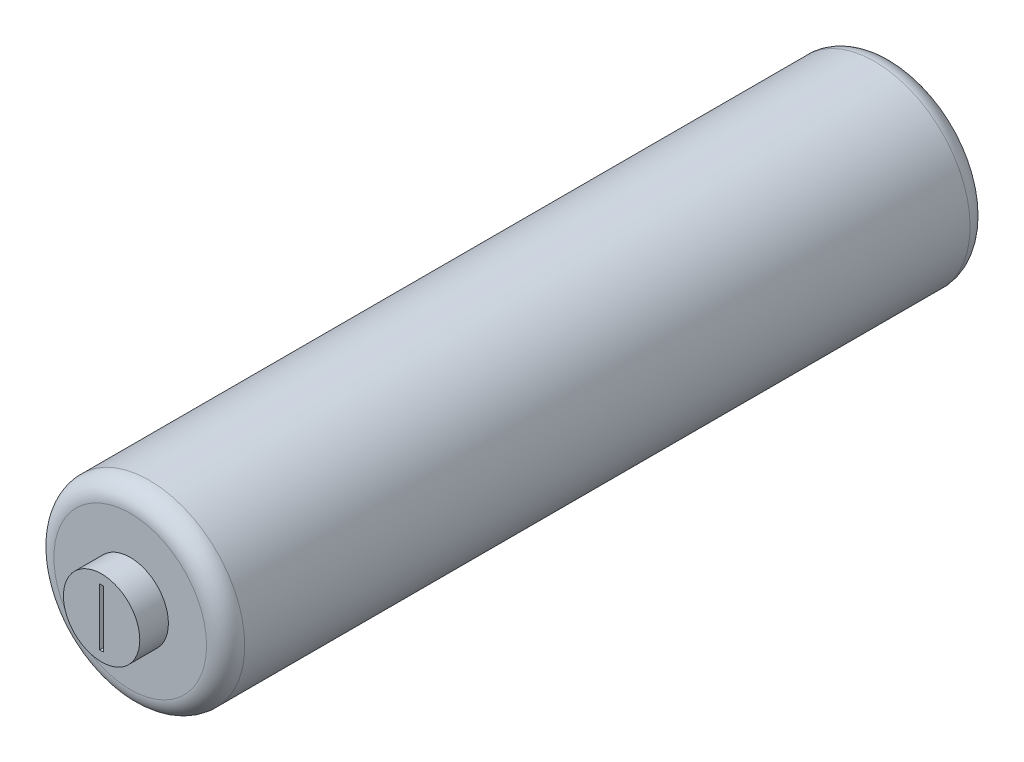
ISO-10303-21;
HEADER;
FILE_DESCRIPTION(('STEP AP214'),'2;1');
FILE_NAME('part.step','',(''),(''),'','','');
FILE_SCHEMA(('AUTOMOTIVE_DESIGN { 1 0 10303 214 1 1 1 1 }'));
ENDSEC;
DATA;
#1=APPLICATION_CONTEXT('core data for automotive mechanical design processes');
#2=APPLICATION_PROTOCOL_DEFINITION('international standard','automotive_design',2000,#1);
#3=PRODUCT_CONTEXT('',#1,'mechanical');
#4=PRODUCT('Part','Part','',(#3));
#5=PRODUCT_RELATED_PRODUCT_CATEGORY('part','',(#4));
#6=PRODUCT_DEFINITION_FORMATION('','',#4);
#7=PRODUCT_DEFINITION_CONTEXT('part definition',#1,'design');
#8=PRODUCT_DEFINITION('design','',#6,#7);
#9=PRODUCT_DEFINITION_SHAPE('','',#8);
#10=(LENGTH_UNIT() NAMED_UNIT(*) SI_UNIT(.MILLI.,.METRE.));
#11=(NAMED_UNIT(*) PLANE_ANGLE_UNIT() SI_UNIT($,.RADIAN.));
#12=(NAMED_UNIT(*) SI_UNIT($,.STERADIAN.) SOLID_ANGLE_UNIT());
#13=UNCERTAINTY_MEASURE_WITH_UNIT(LENGTH_MEASURE(1.E-05),#10,'distance_accuracy_value','');
#14=(GEOMETRIC_REPRESENTATION_CONTEXT(3) GLOBAL_UNCERTAINTY_ASSIGNED_CONTEXT((#13)) GLOBAL_UNIT_ASSIGNED_CONTEXT((#10,
#11,#12)) REPRESENTATION_CONTEXT('',''));
#15=CARTESIAN_POINT('',(0.,0.,0.));
#16=DIRECTION('',(0.,0.,1.));
#17=DIRECTION('',(1.,0.,0.));
#18=AXIS2_PLACEMENT_3D('',#15,#16,#17);
#19=CARTESIAN_POINT('',(0.,0.,-1075.));
#20=DIRECTION('',(0.,0.,-1.));
#21=DIRECTION('',(1.,0.,0.));
#22=AXIS2_PLACEMENT_3D('',#19,#20,#21);
#23=PLANE('',#22);
#24=CARTESIAN_POINT('',(0.,0.,-1075.));
#25=DIRECTION('',(0.,0.,1.));
#26=DIRECTION('',(1.,0.,0.));
#27=AXIS2_PLACEMENT_3D('',#24,#25,#26);
#28=CIRCLE('',#27,100.);
#29=CARTESIAN_POINT('',(100.,0.,-1075.));
#30=VERTEX_POINT('',#29);
#31=EDGE_CURVE('E154',#30,#30,#28,.T.);
#32=ORIENTED_EDGE('',*,*,#31,.F.);
#33=EDGE_LOOP('',(#32));
#34=FACE_BOUND('',#33,.T.);
#35=DIRECTION('',(1.,0.,0.));
#36=VECTOR('',#35,1.);
#37=CARTESIAN_POINT('',(-4.99999999999999,-75.,-1075.));
#38=LINE('',#37,#36);
#39=CARTESIAN_POINT('',(-4.99999999999999,-75.,-1075.));
#40=VERTEX_POINT('',#39);
#41=CARTESIAN_POINT('',(5.00000000000001,-75.,-1075.));
#42=VERTEX_POINT('',#41);
#43=EDGE_CURVE('E145',#40,#42,#38,.T.);
#44=ORIENTED_EDGE('',*,*,#43,.T.);
#45=DIRECTION('',(0.,1.,0.));
#46=VECTOR('',#45,1.);
#47=CARTESIAN_POINT('',(4.99999999999999,75.,-1075.));
#48=LINE('',#47,#46);
#49=CARTESIAN_POINT('',(4.99999999999999,75.,-1075.));
#50=VERTEX_POINT('',#49);
#51=EDGE_CURVE('E59',#42,#50,#48,.T.);
#52=ORIENTED_EDGE('',*,*,#51,.T.);
#53=DIRECTION('',(-1.,0.,0.));
#54=VECTOR('',#53,1.);
#55=CARTESIAN_POINT('',(-5.00000000000001,75.,-1075.));
#56=LINE('',#55,#54);
#57=CARTESIAN_POINT('',(-5.00000000000001,75.,-1075.));
#58=VERTEX_POINT('',#57);
#59=EDGE_CURVE('E132',#50,#58,#56,.T.);
#60=ORIENTED_EDGE('',*,*,#59,.T.);
#61=DIRECTION('',(0.,-1.,0.));
#62=VECTOR('',#61,1.);
#63=CARTESIAN_POINT('',(-5.00000000000001,75.,-1075.));
#64=LINE('',#63,#62);
#65=EDGE_CURVE('E136',#58,#40,#64,.T.);
#66=ORIENTED_EDGE('',*,*,#65,.T.);
#67=EDGE_LOOP('',(#44,#52,#60,#66));
#68=FACE_BOUND('',#67,.T.);
#69=ADVANCED_FACE('F43',(#34,#68),#23,.T.);
#70=CARTESIAN_POINT('',(0.,0.,1000.));
#71=DIRECTION('',(0.,0.,-1.));
#72=DIRECTION('',(-1.,0.,0.));
#73=AXIS2_PLACEMENT_3D('',#70,#71,#72);
#74=CYLINDRICAL_SURFACE('',#73,250.);
#75=CARTESIAN_POINT('',(0.,0.,-950.));
#76=DIRECTION('',(0.,0.,1.));
#77=DIRECTION('',(1.,0.,0.));
#78=AXIS2_PLACEMENT_3D('',#75,#76,#77);
#79=CIRCLE('',#78,250.);
#80=CARTESIAN_POINT('',(250.,0.,-950.));
#81=VERTEX_POINT('',#80);
#82=EDGE_CURVE('E221',#81,#81,#79,.T.);
#83=ORIENTED_EDGE('',*,*,#82,.T.);
#84=EDGE_LOOP('',(#83));
#85=FACE_BOUND('',#84,.T.);
#86=CARTESIAN_POINT('',(0.,0.,950.));
#87=DIRECTION('',(0.,0.,1.));
#88=DIRECTION('',(1.,0.,0.));
#89=AXIS2_PLACEMENT_3D('',#86,#87,#88);
#90=CIRCLE('',#89,250.);
#91=CARTESIAN_POINT('',(250.,0.,950.));
#92=VERTEX_POINT('',#91);
#93=EDGE_CURVE('E214',#92,#92,#90,.F.);
#94=ORIENTED_EDGE('',*,*,#93,.T.);
#95=EDGE_LOOP('',(#94));
#96=FACE_BOUND('',#95,.T.);
#97=ADVANCED_FACE('F236',(#85,#96),#74,.T.);
#98=CARTESIAN_POINT('',(0.,0.,1000.));
#99=DIRECTION('',(0.,0.,1.));
#100=DIRECTION('',(1.,0.,0.));
#101=AXIS2_PLACEMENT_3D('',#98,#99,#100);
#102=PLANE('',#101);
#103=CARTESIAN_POINT('',(0.,0.,1000.));
#104=DIRECTION('',(0.,0.,1.));
#105=DIRECTION('',(1.,0.,0.));
#106=AXIS2_PLACEMENT_3D('',#103,#104,#105);
#107=CIRCLE('',#106,200.);
#108=CARTESIAN_POINT('',(200.,0.,1000.));
#109=VERTEX_POINT('',#108);
#110=EDGE_CURVE('E11',#109,#109,#107,.T.);
#111=ORIENTED_EDGE('',*,*,#110,.T.);
#112=EDGE_LOOP('',(#111));
#113=FACE_BOUND('',#112,.T.);
#114=CARTESIAN_POINT('',(0.,0.,1000.));
#115=DIRECTION('',(0.,0.,1.));
#116=DIRECTION('',(1.,0.,0.));
#117=AXIS2_PLACEMENT_3D('',#114,#115,#116);
#118=CIRCLE('',#117,100.);
#119=CARTESIAN_POINT('',(100.,0.,1000.));
#120=VERTEX_POINT('',#119);
#121=EDGE_CURVE('E210',#120,#120,#118,.F.);
#122=ORIENTED_EDGE('',*,*,#121,.T.);
#123=EDGE_LOOP('',(#122));
#124=FACE_BOUND('',#123,.T.);
#125=ADVANCED_FACE('F239',(#113,#124),#102,.T.);
#126=CARTESIAN_POINT('',(0.,0.,-1000.));
#127=DIRECTION('',(0.,0.,1.));
#128=DIRECTION('',(1.,0.,0.));
#129=AXIS2_PLACEMENT_3D('',#126,#127,#128);
#130=PLANE('',#129);
#131=CARTESIAN_POINT('',(0.,0.,-1000.));
#132=DIRECTION('',(0.,0.,1.));
#133=DIRECTION('',(1.,0.,0.));
#134=AXIS2_PLACEMENT_3D('',#131,#132,#133);
#135=CIRCLE('',#134,200.);
#136=CARTESIAN_POINT('',(200.,0.,-1000.));
#137=VERTEX_POINT('',#136);
#138=EDGE_CURVE('E52',#137,#137,#135,.F.);
#139=ORIENTED_EDGE('',*,*,#138,.T.);
#140=EDGE_LOOP('',(#139));
#141=FACE_BOUND('',#140,.T.);
#142=CARTESIAN_POINT('',(0.,0.,-1000.));
#143=DIRECTION('',(0.,0.,1.));
#144=DIRECTION('',(1.,0.,0.));
#145=AXIS2_PLACEMENT_3D('',#142,#143,#144);
#146=CIRCLE('',#145,100.);
#147=CARTESIAN_POINT('',(100.,0.,-1000.));
#148=VERTEX_POINT('',#147);
#149=EDGE_CURVE('E163',#148,#148,#146,.T.);
#150=ORIENTED_EDGE('',*,*,#149,.T.);
#151=EDGE_LOOP('',(#150));
#152=FACE_BOUND('',#151,.T.);
#153=ADVANCED_FACE('F228',(#141,#152),#130,.F.);
#154=CARTESIAN_POINT('',(0.,0.,1075.));
#155=DIRECTION('',(0.,0.,-1.));
#156=DIRECTION('',(-1.,0.,0.));
#157=AXIS2_PLACEMENT_3D('',#154,#155,#156);
#158=CYLINDRICAL_SURFACE('',#157,100.);
#159=ORIENTED_EDGE('',*,*,#121,.F.);
#160=EDGE_LOOP('',(#159));
#161=FACE_BOUND('',#160,.T.);
#162=CARTESIAN_POINT('',(0.,0.,1075.));
#163=DIRECTION('',(0.,0.,1.));
#164=DIRECTION('',(1.,0.,0.));
#165=AXIS2_PLACEMENT_3D('',#162,#163,#164);
#166=CIRCLE('',#165,100.);
#167=CARTESIAN_POINT('',(100.,0.,1075.));
#168=VERTEX_POINT('',#167);
#169=EDGE_CURVE('E198',#168,#168,#166,.T.);
#170=ORIENTED_EDGE('',*,*,#169,.F.);
#171=EDGE_LOOP('',(#170));
#172=FACE_BOUND('',#171,.T.);
#173=ADVANCED_FACE('F252',(#161,#172),#158,.T.);
#174=CARTESIAN_POINT('',(0.,0.,1075.));
#175=DIRECTION('',(0.,0.,1.));
#176=DIRECTION('',(1.,0.,0.));
#177=AXIS2_PLACEMENT_3D('',#174,#175,#176);
#178=PLANE('',#177);
#179=DIRECTION('',(0.,1.,0.));
#180=VECTOR('',#179,1.);
#181=CARTESIAN_POINT('',(4.99999999999999,75.,1075.));
#182=LINE('',#181,#180);
#183=CARTESIAN_POINT('',(5.00000000000001,-75.,1075.));
#184=VERTEX_POINT('',#183);
#185=CARTESIAN_POINT('',(4.99999999999999,75.,1075.));
#186=VERTEX_POINT('',#185);
#187=EDGE_CURVE('E67',#184,#186,#182,.T.);
#188=ORIENTED_EDGE('',*,*,#187,.F.);
#189=DIRECTION('',(1.,0.,0.));
#190=VECTOR('',#189,1.);
#191=CARTESIAN_POINT('',(-4.99999999999999,-75.,1075.));
#192=LINE('',#191,#190);
#193=CARTESIAN_POINT('',(-4.99999999999999,-75.,1075.));
#194=VERTEX_POINT('',#193);
#195=EDGE_CURVE('E169',#194,#184,#192,.T.);
#196=ORIENTED_EDGE('',*,*,#195,.F.);
#197=DIRECTION('',(0.,-1.,0.));
#198=VECTOR('',#197,1.);
#199=CARTESIAN_POINT('',(-5.00000000000001,75.,1075.));
#200=LINE('',#199,#198);
#201=CARTESIAN_POINT('',(-5.00000000000001,75.,1075.));
#202=VERTEX_POINT('',#201);
#203=EDGE_CURVE('E188',#202,#194,#200,.T.);
#204=ORIENTED_EDGE('',*,*,#203,.F.);
#205=DIRECTION('',(-1.,0.,0.));
#206=VECTOR('',#205,1.);
#207=CARTESIAN_POINT('',(-5.00000000000001,75.,1075.));
#208=LINE('',#207,#206);
#209=EDGE_CURVE('E184',#186,#202,#208,.T.);
#210=ORIENTED_EDGE('',*,*,#209,.F.);
#211=EDGE_LOOP('',(#188,#196,#204,#210));
#212=FACE_BOUND('',#211,.T.);
#213=ORIENTED_EDGE('',*,*,#169,.T.);
#214=EDGE_LOOP('',(#213));
#215=FACE_BOUND('',#214,.T.);
#216=ADVANCED_FACE('F255',(#212,#215),#178,.T.);
#217=CARTESIAN_POINT('',(4.99999999999999,75.,1065.));
#218=DIRECTION('',(1.,0.,0.));
#219=DIRECTION('',(0.,1.,0.));
#220=AXIS2_PLACEMENT_3D('',#217,#218,#219);
#221=PLANE('',#220);
#222=ORIENTED_EDGE('',*,*,#187,.T.);
#223=DIRECTION('',(0.,0.,1.));
#224=VECTOR('',#223,1.);
#225=CARTESIAN_POINT('',(4.99999999999999,75.,1065.));
#226=LINE('',#225,#224);
#227=CARTESIAN_POINT('',(4.99999999999999,75.,1065.));
#228=VERTEX_POINT('',#227);
#229=EDGE_CURVE('E181',#228,#186,#226,.T.);
#230=ORIENTED_EDGE('',*,*,#229,.F.);
#231=DIRECTION('',(0.,1.,0.));
#232=VECTOR('',#231,1.);
#233=CARTESIAN_POINT('',(4.99999999999999,75.,1065.));
#234=LINE('',#233,#232);
#235=CARTESIAN_POINT('',(5.00000000000001,-75.,1065.));
#236=VERTEX_POINT('',#235);
#237=EDGE_CURVE('E164',#236,#228,#234,.T.);
#238=ORIENTED_EDGE('',*,*,#237,.F.);
#239=DIRECTION('',(0.,0.,1.));
#240=VECTOR('',#239,1.);
#241=CARTESIAN_POINT('',(5.00000000000001,-75.,1065.));
#242=LINE('',#241,#240);
#243=EDGE_CURVE('E195',#236,#184,#242,.T.);
#244=ORIENTED_EDGE('',*,*,#243,.T.);
#245=EDGE_LOOP('',(#222,#230,#238,#244));
#246=FACE_BOUND('',#245,.T.);
#247=ADVANCED_FACE('F260',(#246),#221,.F.);
#248=CARTESIAN_POINT('',(-4.99999999999999,-75.,1065.));
#249=DIRECTION('',(0.,-1.,0.));
#250=DIRECTION('',(0.,0.,-1.));
#251=AXIS2_PLACEMENT_3D('',#248,#249,#250);
#252=PLANE('',#251);
#253=ORIENTED_EDGE('',*,*,#195,.T.);
#254=ORIENTED_EDGE('',*,*,#243,.F.);
#255=DIRECTION('',(1.,0.,0.));
#256=VECTOR('',#255,1.);
#257=CARTESIAN_POINT('',(-4.99999999999999,-75.,1065.));
#258=LINE('',#257,#256);
#259=CARTESIAN_POINT('',(-4.99999999999999,-75.,1065.));
#260=VERTEX_POINT('',#259);
#261=EDGE_CURVE('E177',#260,#236,#258,.T.);
#262=ORIENTED_EDGE('',*,*,#261,.F.);
#263=DIRECTION('',(0.,0.,1.));
#264=VECTOR('',#263,1.);
#265=CARTESIAN_POINT('',(-4.99999999999999,-75.,1065.));
#266=LINE('',#265,#264);
#267=EDGE_CURVE('E199',#260,#194,#266,.T.);
#268=ORIENTED_EDGE('',*,*,#267,.T.);
#269=EDGE_LOOP('',(#253,#254,#262,#268));
#270=FACE_BOUND('',#269,.T.);
#271=ADVANCED_FACE('F266',(#270),#252,.F.);
#272=CARTESIAN_POINT('',(-5.00000000000001,75.,1065.));
#273=DIRECTION('',(-1.,0.,0.));
#274=DIRECTION('',(0.,-1.,0.));
#275=AXIS2_PLACEMENT_3D('',#272,#273,#274);
#276=PLANE('',#275);
#277=ORIENTED_EDGE('',*,*,#203,.T.);
#278=ORIENTED_EDGE('',*,*,#267,.F.);
#279=DIRECTION('',(0.,-1.,0.));
#280=VECTOR('',#279,1.);
#281=CARTESIAN_POINT('',(-5.00000000000001,75.,1065.));
#282=LINE('',#281,#280);
#283=CARTESIAN_POINT('',(-5.00000000000001,75.,1065.));
#284=VERTEX_POINT('',#283);
#285=EDGE_CURVE('E173',#284,#260,#282,.T.);
#286=ORIENTED_EDGE('',*,*,#285,.F.);
#287=DIRECTION('',(0.,0.,1.));
#288=VECTOR('',#287,1.);
#289=CARTESIAN_POINT('',(-5.00000000000001,75.,1065.));
#290=LINE('',#289,#288);
#291=EDGE_CURVE('E202',#284,#202,#290,.T.);
#292=ORIENTED_EDGE('',*,*,#291,.T.);
#293=EDGE_LOOP('',(#277,#278,#286,#292));
#294=FACE_BOUND('',#293,.T.);
#295=ADVANCED_FACE('F289',(#294),#276,.F.);
#296=CARTESIAN_POINT('',(-5.00000000000001,75.,1065.));
#297=DIRECTION('',(0.,1.,0.));
#298=DIRECTION('',(0.,0.,1.));
#299=AXIS2_PLACEMENT_3D('',#296,#297,#298);
#300=PLANE('',#299);
#301=ORIENTED_EDGE('',*,*,#209,.T.);
#302=ORIENTED_EDGE('',*,*,#291,.F.);
#303=DIRECTION('',(-1.,0.,0.));
#304=VECTOR('',#303,1.);
#305=CARTESIAN_POINT('',(-5.00000000000001,75.,1065.));
#306=LINE('',#305,#304);
#307=EDGE_CURVE('E168',#228,#284,#306,.T.);
#308=ORIENTED_EDGE('',*,*,#307,.F.);
#309=ORIENTED_EDGE('',*,*,#229,.T.);
#310=EDGE_LOOP('',(#301,#302,#308,#309));
#311=FACE_BOUND('',#310,.T.);
#312=ADVANCED_FACE('F285',(#311),#300,.F.);
#313=CARTESIAN_POINT('',(0.,0.,1065.));
#314=DIRECTION('',(0.,0.,1.));
#315=DIRECTION('',(1.,0.,0.));
#316=AXIS2_PLACEMENT_3D('',#313,#314,#315);
#317=PLANE('',#316);
#318=ORIENTED_EDGE('',*,*,#237,.T.);
#319=ORIENTED_EDGE('',*,*,#307,.T.);
#320=ORIENTED_EDGE('',*,*,#285,.T.);
#321=ORIENTED_EDGE('',*,*,#261,.T.);
#322=EDGE_LOOP('',(#318,#319,#320,#321));
#323=FACE_BOUND('',#322,.T.);
#324=ADVANCED_FACE('F281',(#323),#317,.T.);
#325=CARTESIAN_POINT('',(0.,0.,-1075.));
#326=DIRECTION('',(0.,0.,1.));
#327=DIRECTION('',(1.,0.,0.));
#328=AXIS2_PLACEMENT_3D('',#325,#326,#327);
#329=CYLINDRICAL_SURFACE('',#328,100.);
#330=ORIENTED_EDGE('',*,*,#31,.T.);
#331=EDGE_LOOP('',(#330));
#332=FACE_BOUND('',#331,.T.);
#333=ORIENTED_EDGE('',*,*,#149,.F.);
#334=EDGE_LOOP('',(#333));
#335=FACE_BOUND('',#334,.T.);
#336=ADVANCED_FACE('F278',(#332,#335),#329,.T.);
#337=CARTESIAN_POINT('',(4.99999999999999,75.,-1065.));
#338=DIRECTION('',(-1.,0.,0.));
#339=DIRECTION('',(0.,-1.,0.));
#340=AXIS2_PLACEMENT_3D('',#337,#338,#339);
#341=PLANE('',#340);
#342=ORIENTED_EDGE('',*,*,#51,.F.);
#343=DIRECTION('',(0.,0.,-1.));
#344=VECTOR('',#343,1.);
#345=CARTESIAN_POINT('',(5.00000000000001,-75.,-1065.));
#346=LINE('',#345,#344);
#347=CARTESIAN_POINT('',(5.00000000000001,-75.,-1065.));
#348=VERTEX_POINT('',#347);
#349=EDGE_CURVE('E114',#348,#42,#346,.T.);
#350=ORIENTED_EDGE('',*,*,#349,.F.);
#351=DIRECTION('',(0.,1.,0.));
#352=VECTOR('',#351,1.);
#353=CARTESIAN_POINT('',(4.99999999999999,75.,-1065.));
#354=LINE('',#353,#352);
#355=CARTESIAN_POINT('',(4.99999999999999,75.,-1065.));
#356=VERTEX_POINT('',#355);
#357=EDGE_CURVE('E122',#348,#356,#354,.T.);
#358=ORIENTED_EDGE('',*,*,#357,.T.);
#359=DIRECTION('',(0.,0.,-1.));
#360=VECTOR('',#359,1.);
#361=CARTESIAN_POINT('',(4.99999999999999,75.,-1065.));
#362=LINE('',#361,#360);
#363=EDGE_CURVE('E151',#356,#50,#362,.T.);
#364=ORIENTED_EDGE('',*,*,#363,.T.);
#365=EDGE_LOOP('',(#342,#350,#358,#364));
#366=FACE_BOUND('',#365,.T.);
#367=ADVANCED_FACE('F125',(#366),#341,.T.);
#368=CARTESIAN_POINT('',(-5.00000000000001,75.,-1065.));
#369=DIRECTION('',(0.,-1.,0.));
#370=DIRECTION('',(0.,0.,-1.));
#371=AXIS2_PLACEMENT_3D('',#368,#369,#370);
#372=PLANE('',#371);
#373=ORIENTED_EDGE('',*,*,#59,.F.);
#374=ORIENTED_EDGE('',*,*,#363,.F.);
#375=DIRECTION('',(-1.,0.,0.));
#376=VECTOR('',#375,1.);
#377=CARTESIAN_POINT('',(-5.00000000000001,75.,-1065.));
#378=LINE('',#377,#376);
#379=CARTESIAN_POINT('',(-5.00000000000001,75.,-1065.));
#380=VERTEX_POINT('',#379);
#381=EDGE_CURVE('E128',#356,#380,#378,.T.);
#382=ORIENTED_EDGE('',*,*,#381,.T.);
#383=DIRECTION('',(0.,0.,-1.));
#384=VECTOR('',#383,1.);
#385=CARTESIAN_POINT('',(-5.00000000000001,75.,-1065.));
#386=LINE('',#385,#384);
#387=EDGE_CURVE('E155',#380,#58,#386,.T.);
#388=ORIENTED_EDGE('',*,*,#387,.T.);
#389=EDGE_LOOP('',(#373,#374,#382,#388));
#390=FACE_BOUND('',#389,.T.);
#391=ADVANCED_FACE('F321',(#390),#372,.T.);
#392=CARTESIAN_POINT('',(-5.00000000000001,75.,-1065.));
#393=DIRECTION('',(1.,0.,0.));
#394=DIRECTION('',(0.,1.,0.));
#395=AXIS2_PLACEMENT_3D('',#392,#393,#394);
#396=PLANE('',#395);
#397=ORIENTED_EDGE('',*,*,#65,.F.);
#398=ORIENTED_EDGE('',*,*,#387,.F.);
#399=DIRECTION('',(0.,-1.,0.));
#400=VECTOR('',#399,1.);
#401=CARTESIAN_POINT('',(-5.00000000000001,75.,-1065.));
#402=LINE('',#401,#400);
#403=CARTESIAN_POINT('',(-4.99999999999999,-75.,-1065.));
#404=VERTEX_POINT('',#403);
#405=EDGE_CURVE('E121',#380,#404,#402,.T.);
#406=ORIENTED_EDGE('',*,*,#405,.T.);
#407=DIRECTION('',(0.,0.,-1.));
#408=VECTOR('',#407,1.);
#409=CARTESIAN_POINT('',(-4.99999999999999,-75.,-1065.));
#410=LINE('',#409,#408);
#411=EDGE_CURVE('E116',#404,#40,#410,.T.);
#412=ORIENTED_EDGE('',*,*,#411,.T.);
#413=EDGE_LOOP('',(#397,#398,#406,#412));
#414=FACE_BOUND('',#413,.T.);
#415=ADVANCED_FACE('F327',(#414),#396,.T.);
#416=CARTESIAN_POINT('',(-4.99999999999999,-75.,-1065.));
#417=DIRECTION('',(0.,1.,0.));
#418=DIRECTION('',(0.,0.,1.));
#419=AXIS2_PLACEMENT_3D('',#416,#417,#418);
#420=PLANE('',#419);
#421=ORIENTED_EDGE('',*,*,#43,.F.);
#422=ORIENTED_EDGE('',*,*,#411,.F.);
#423=DIRECTION('',(1.,0.,0.));
#424=VECTOR('',#423,1.);
#425=CARTESIAN_POINT('',(-4.99999999999999,-75.,-1065.));
#426=LINE('',#425,#424);
#427=EDGE_CURVE('E111',#404,#348,#426,.T.);
#428=ORIENTED_EDGE('',*,*,#427,.T.);
#429=ORIENTED_EDGE('',*,*,#349,.T.);
#430=EDGE_LOOP('',(#421,#422,#428,#429));
#431=FACE_BOUND('',#430,.T.);
#432=ADVANCED_FACE('F113',(#431),#420,.T.);
#433=CARTESIAN_POINT('',(0.,0.,-1065.));
#434=DIRECTION('',(0.,0.,-1.));
#435=DIRECTION('',(1.,0.,0.));
#436=AXIS2_PLACEMENT_3D('',#433,#434,#435);
#437=PLANE('',#436);
#438=ORIENTED_EDGE('',*,*,#357,.F.);
#439=ORIENTED_EDGE('',*,*,#427,.F.);
#440=ORIENTED_EDGE('',*,*,#405,.F.);
#441=ORIENTED_EDGE('',*,*,#381,.F.);
#442=EDGE_LOOP('',(#438,#439,#440,#441));
#443=FACE_BOUND('',#442,.T.);
#444=ADVANCED_FACE('F130',(#443),#437,.T.);
#445=CARTESIAN_POINT('',(0.,0.,-950.));
#446=DIRECTION('',(0.,0.,1.));
#447=DIRECTION('',(1.,0.,0.));
#448=AXIS2_PLACEMENT_3D('',#445,#446,#447);
#449=TOROIDAL_SURFACE('',#448,200.,50.);
#450=ORIENTED_EDGE('',*,*,#138,.F.);
#451=EDGE_LOOP('',(#450));
#452=FACE_BOUND('',#451,.T.);
#453=ORIENTED_EDGE('',*,*,#82,.F.);
#454=EDGE_LOOP('',(#453));
#455=FACE_BOUND('',#454,.T.);
#456=ADVANCED_FACE('F231',(#452,#455),#449,.T.);
#457=CARTESIAN_POINT('',(0.,0.,950.));
#458=DIRECTION('',(0.,0.,1.));
#459=DIRECTION('',(1.,0.,0.));
#460=AXIS2_PLACEMENT_3D('',#457,#458,#459);
#461=TOROIDAL_SURFACE('',#460,200.,50.);
#462=ORIENTED_EDGE('',*,*,#93,.F.);
#463=EDGE_LOOP('',(#462));
#464=FACE_BOUND('',#463,.T.);
#465=ORIENTED_EDGE('',*,*,#110,.F.);
#466=EDGE_LOOP('',(#465));
#467=FACE_BOUND('',#466,.T.);
#468=ADVANCED_FACE('F45',(#464,#467),#461,.T.);
#469=CLOSED_SHELL('',(#69,#97,#125,#153,#173,#216,#247,#271,#295,#312,#324,#336,#367,#391,#415,
#432,#444,#456,#468));
#470=MANIFOLD_SOLID_BREP('B2',#469);
#471=ADVANCED_BREP_SHAPE_REPRESENTATION('',(#18,#470),#14);
#472=SHAPE_DEFINITION_REPRESENTATION(#9,#471);
ENDSEC;
END-ISO-10303-21;
